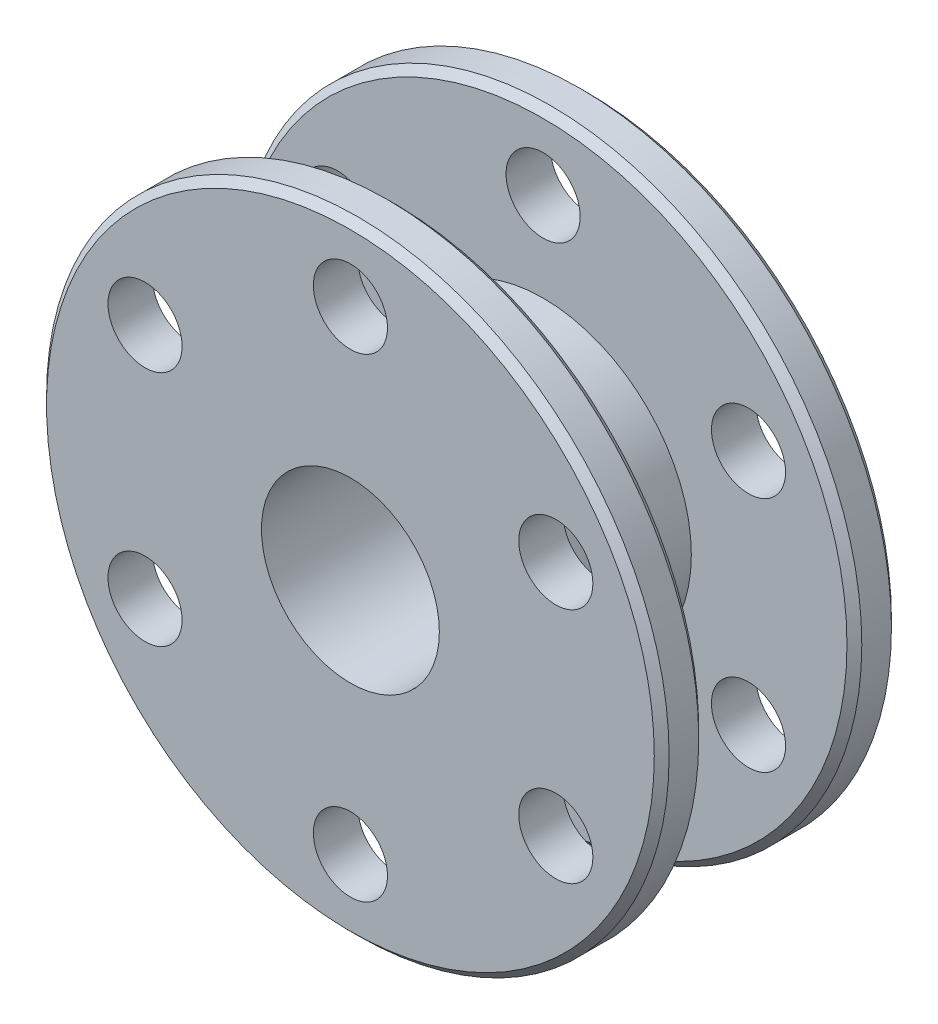
ISO-10303-21;
HEADER;
FILE_DESCRIPTION(('STEP AP214'),'2;1');
FILE_NAME('part.step','',(''),(''),'','','');
FILE_SCHEMA(('AUTOMOTIVE_DESIGN { 1 0 10303 214 1 1 1 1 }'));
ENDSEC;
DATA;
#1=APPLICATION_CONTEXT('core data for automotive mechanical design processes');
#2=APPLICATION_PROTOCOL_DEFINITION('international standard','automotive_design',2000,#1);
#3=PRODUCT_CONTEXT('',#1,'mechanical');
#4=PRODUCT('Part','Part','',(#3));
#5=PRODUCT_RELATED_PRODUCT_CATEGORY('part','',(#4));
#6=PRODUCT_DEFINITION_FORMATION('','',#4);
#7=PRODUCT_DEFINITION_CONTEXT('part definition',#1,'design');
#8=PRODUCT_DEFINITION('design','',#6,#7);
#9=PRODUCT_DEFINITION_SHAPE('','',#8);
#10=(LENGTH_UNIT() NAMED_UNIT(*) SI_UNIT(.MILLI.,.METRE.));
#11=(NAMED_UNIT(*) PLANE_ANGLE_UNIT() SI_UNIT($,.RADIAN.));
#12=(NAMED_UNIT(*) SI_UNIT($,.STERADIAN.) SOLID_ANGLE_UNIT());
#13=UNCERTAINTY_MEASURE_WITH_UNIT(LENGTH_MEASURE(1.E-05),#10,'distance_accuracy_value','');
#14=(GEOMETRIC_REPRESENTATION_CONTEXT(3) GLOBAL_UNCERTAINTY_ASSIGNED_CONTEXT((#13)) GLOBAL_UNIT_ASSIGNED_CONTEXT((#10,
#11,#12)) REPRESENTATION_CONTEXT('',''));
#15=CARTESIAN_POINT('',(0.,0.,0.));
#16=DIRECTION('',(0.,0.,1.));
#17=DIRECTION('',(1.,0.,0.));
#18=AXIS2_PLACEMENT_3D('',#15,#16,#17);
#19=CARTESIAN_POINT('',(0.,0.,16.));
#20=DIRECTION('',(0.,0.,-1.));
#21=DIRECTION('',(-1.,0.,0.));
#22=AXIS2_PLACEMENT_3D('',#19,#20,#21);
#23=CYLINDRICAL_SURFACE('',#22,6.);
#24=CARTESIAN_POINT('',(0.,0.,16.));
#25=DIRECTION('',(0.,0.,1.));
#26=DIRECTION('',(1.,0.,0.));
#27=AXIS2_PLACEMENT_3D('',#24,#25,#26);
#28=CIRCLE('',#27,6.);
#29=CARTESIAN_POINT('',(6.,0.,16.));
#30=VERTEX_POINT('',#29);
#31=EDGE_CURVE('E68',#30,#30,#28,.T.);
#32=ORIENTED_EDGE('',*,*,#31,.T.);
#33=EDGE_LOOP('',(#32));
#34=FACE_BOUND('',#33,.T.);
#35=CARTESIAN_POINT('',(0.,0.,0.));
#36=DIRECTION('',(0.,0.,1.));
#37=DIRECTION('',(1.,0.,0.));
#38=AXIS2_PLACEMENT_3D('',#35,#36,#37);
#39=CIRCLE('',#38,6.);
#40=CARTESIAN_POINT('',(6.,0.,0.));
#41=VERTEX_POINT('',#40);
#42=EDGE_CURVE('E69',#41,#41,#39,.T.);
#43=ORIENTED_EDGE('',*,*,#42,.F.);
#44=EDGE_LOOP('',(#43));
#45=FACE_BOUND('',#44,.T.);
#46=ADVANCED_FACE('F35',(#34,#45),#23,.F.);
#47=CARTESIAN_POINT('',(0.,0.,16.));
#48=DIRECTION('',(0.,0.,-1.));
#49=DIRECTION('',(-1.,0.,0.));
#50=AXIS2_PLACEMENT_3D('',#47,#48,#49);
#51=CYLINDRICAL_SURFACE('',#50,10.);
#52=CARTESIAN_POINT('',(0.,0.,13.));
#53=DIRECTION('',(0.,0.,1.));
#54=DIRECTION('',(1.,0.,0.));
#55=AXIS2_PLACEMENT_3D('',#52,#53,#54);
#56=CIRCLE('',#55,10.);
#57=CARTESIAN_POINT('',(10.,0.,13.));
#58=VERTEX_POINT('',#57);
#59=EDGE_CURVE('E94',#58,#58,#56,.T.);
#60=ORIENTED_EDGE('',*,*,#59,.F.);
#61=EDGE_LOOP('',(#60));
#62=FACE_BOUND('',#61,.T.);
#63=CARTESIAN_POINT('',(0.,0.,3.));
#64=DIRECTION('',(0.,0.,1.));
#65=DIRECTION('',(1.,0.,0.));
#66=AXIS2_PLACEMENT_3D('',#63,#64,#65);
#67=CIRCLE('',#66,10.);
#68=CARTESIAN_POINT('',(10.,0.,3.));
#69=VERTEX_POINT('',#68);
#70=EDGE_CURVE('E72',#69,#69,#67,.T.);
#71=ORIENTED_EDGE('',*,*,#70,.T.);
#72=EDGE_LOOP('',(#71));
#73=FACE_BOUND('',#72,.T.);
#74=ADVANCED_FACE('F168',(#62,#73),#51,.T.);
#75=CARTESIAN_POINT('',(0.,0.,16.));
#76=DIRECTION('',(0.,0.,1.));
#77=DIRECTION('',(1.,0.,0.));
#78=AXIS2_PLACEMENT_3D('',#75,#76,#77);
#79=PLANE('',#78);
#80=CARTESIAN_POINT('',(0.,0.,16.));
#81=DIRECTION('',(0.,0.,1.));
#82=DIRECTION('',(1.,0.,0.));
#83=AXIS2_PLACEMENT_3D('',#80,#81,#82);
#84=CIRCLE('',#83,20.5);
#85=CARTESIAN_POINT('',(20.5,0.,16.));
#86=VERTEX_POINT('',#85);
#87=EDGE_CURVE('E10',#86,#86,#84,.T.);
#88=ORIENTED_EDGE('',*,*,#87,.T.);
#89=EDGE_LOOP('',(#88));
#90=FACE_BOUND('',#89,.T.);
#91=ORIENTED_EDGE('',*,*,#31,.F.);
#92=EDGE_LOOP('',(#91));
#93=FACE_BOUND('',#92,.T.);
#94=CARTESIAN_POINT('',(-13.856406460551,8.,16.));
#95=DIRECTION('',(0.,0.,1.));
#96=DIRECTION('',(1.,0.,0.));
#97=AXIS2_PLACEMENT_3D('',#94,#95,#96);
#98=CIRCLE('',#97,2.50000000000018);
#99=CARTESIAN_POINT('',(-11.3564064605509,8.,16.));
#100=VERTEX_POINT('',#99);
#101=EDGE_CURVE('E130',#100,#100,#98,.T.);
#102=ORIENTED_EDGE('',*,*,#101,.F.);
#103=EDGE_LOOP('',(#102));
#104=FACE_BOUND('',#103,.T.);
#105=CARTESIAN_POINT('',(-13.856406460551,-8.,16.));
#106=DIRECTION('',(0.,0.,1.));
#107=DIRECTION('',(1.,0.,0.));
#108=AXIS2_PLACEMENT_3D('',#105,#106,#107);
#109=CIRCLE('',#108,2.50000000000013);
#110=CARTESIAN_POINT('',(-11.3564064605509,-8.,16.));
#111=VERTEX_POINT('',#110);
#112=EDGE_CURVE('E127',#111,#111,#109,.T.);
#113=ORIENTED_EDGE('',*,*,#112,.F.);
#114=EDGE_LOOP('',(#113));
#115=FACE_BOUND('',#114,.T.);
#116=CARTESIAN_POINT('',(0.,-16.,16.));
#117=DIRECTION('',(0.,0.,1.));
#118=DIRECTION('',(1.,0.,0.));
#119=AXIS2_PLACEMENT_3D('',#116,#117,#118);
#120=CIRCLE('',#119,2.50000000000009);
#121=CARTESIAN_POINT('',(2.50000000000008,-16.,16.));
#122=VERTEX_POINT('',#121);
#123=EDGE_CURVE('E124',#122,#122,#120,.T.);
#124=ORIENTED_EDGE('',*,*,#123,.F.);
#125=EDGE_LOOP('',(#124));
#126=FACE_BOUND('',#125,.T.);
#127=CARTESIAN_POINT('',(13.856406460551,-8.,16.));
#128=DIRECTION('',(0.,0.,1.));
#129=DIRECTION('',(1.,0.,0.));
#130=AXIS2_PLACEMENT_3D('',#127,#128,#129);
#131=CIRCLE('',#130,2.50000000000007);
#132=CARTESIAN_POINT('',(16.3564064605511,-8.,16.));
#133=VERTEX_POINT('',#132);
#134=EDGE_CURVE('E121',#133,#133,#131,.T.);
#135=ORIENTED_EDGE('',*,*,#134,.F.);
#136=EDGE_LOOP('',(#135));
#137=FACE_BOUND('',#136,.T.);
#138=CARTESIAN_POINT('',(13.856406460551,8.,16.));
#139=DIRECTION('',(0.,0.,1.));
#140=DIRECTION('',(1.,0.,0.));
#141=AXIS2_PLACEMENT_3D('',#138,#139,#140);
#142=CIRCLE('',#141,2.50000000000004);
#143=CARTESIAN_POINT('',(16.356406460551,8.,16.));
#144=VERTEX_POINT('',#143);
#145=EDGE_CURVE('E118',#144,#144,#142,.T.);
#146=ORIENTED_EDGE('',*,*,#145,.F.);
#147=EDGE_LOOP('',(#146));
#148=FACE_BOUND('',#147,.T.);
#149=CARTESIAN_POINT('',(0.,16.,16.));
#150=DIRECTION('',(0.,0.,1.));
#151=DIRECTION('',(1.,0.,0.));
#152=AXIS2_PLACEMENT_3D('',#149,#150,#151);
#153=CIRCLE('',#152,2.5);
#154=CARTESIAN_POINT('',(2.5,16.,16.));
#155=VERTEX_POINT('',#154);
#156=EDGE_CURVE('E114',#155,#155,#153,.T.);
#157=ORIENTED_EDGE('',*,*,#156,.F.);
#158=EDGE_LOOP('',(#157));
#159=FACE_BOUND('',#158,.T.);
#160=ADVANCED_FACE('F164',(#90,#93,#104,#115,#126,#137,#148,#159),#79,.T.);
#161=CARTESIAN_POINT('',(0.,0.,0.));
#162=DIRECTION('',(0.,0.,1.));
#163=DIRECTION('',(1.,0.,0.));
#164=AXIS2_PLACEMENT_3D('',#161,#162,#163);
#165=PLANE('',#164);
#166=CARTESIAN_POINT('',(0.,0.,0.));
#167=DIRECTION('',(0.,0.,1.));
#168=DIRECTION('',(1.,0.,0.));
#169=AXIS2_PLACEMENT_3D('',#166,#167,#168);
#170=CIRCLE('',#169,20.5);
#171=CARTESIAN_POINT('',(20.5,0.,0.));
#172=VERTEX_POINT('',#171);
#173=EDGE_CURVE('E59',#172,#172,#170,.F.);
#174=ORIENTED_EDGE('',*,*,#173,.T.);
#175=EDGE_LOOP('',(#174));
#176=FACE_BOUND('',#175,.T.);
#177=ORIENTED_EDGE('',*,*,#42,.T.);
#178=EDGE_LOOP('',(#177));
#179=FACE_BOUND('',#178,.T.);
#180=CARTESIAN_POINT('',(-13.856406460551,8.,0.));
#181=DIRECTION('',(0.,0.,1.));
#182=DIRECTION('',(1.,0.,0.));
#183=AXIS2_PLACEMENT_3D('',#180,#181,#182);
#184=CIRCLE('',#183,2.50000000000018);
#185=CARTESIAN_POINT('',(-11.3564064605509,8.,0.));
#186=VERTEX_POINT('',#185);
#187=EDGE_CURVE('E91',#186,#186,#184,.T.);
#188=ORIENTED_EDGE('',*,*,#187,.T.);
#189=EDGE_LOOP('',(#188));
#190=FACE_BOUND('',#189,.T.);
#191=CARTESIAN_POINT('',(-13.856406460551,-8.,0.));
#192=DIRECTION('',(0.,0.,1.));
#193=DIRECTION('',(1.,0.,0.));
#194=AXIS2_PLACEMENT_3D('',#191,#192,#193);
#195=CIRCLE('',#194,2.50000000000013);
#196=CARTESIAN_POINT('',(-11.3564064605509,-8.,0.));
#197=VERTEX_POINT('',#196);
#198=EDGE_CURVE('E88',#197,#197,#195,.T.);
#199=ORIENTED_EDGE('',*,*,#198,.T.);
#200=EDGE_LOOP('',(#199));
#201=FACE_BOUND('',#200,.T.);
#202=CARTESIAN_POINT('',(0.,-16.,0.));
#203=DIRECTION('',(0.,0.,1.));
#204=DIRECTION('',(1.,0.,0.));
#205=AXIS2_PLACEMENT_3D('',#202,#203,#204);
#206=CIRCLE('',#205,2.50000000000009);
#207=CARTESIAN_POINT('',(2.50000000000008,-16.,0.));
#208=VERTEX_POINT('',#207);
#209=EDGE_CURVE('E85',#208,#208,#206,.T.);
#210=ORIENTED_EDGE('',*,*,#209,.T.);
#211=EDGE_LOOP('',(#210));
#212=FACE_BOUND('',#211,.T.);
#213=CARTESIAN_POINT('',(13.856406460551,-8.,0.));
#214=DIRECTION('',(0.,0.,1.));
#215=DIRECTION('',(1.,0.,0.));
#216=AXIS2_PLACEMENT_3D('',#213,#214,#215);
#217=CIRCLE('',#216,2.50000000000007);
#218=CARTESIAN_POINT('',(16.3564064605511,-8.,0.));
#219=VERTEX_POINT('',#218);
#220=EDGE_CURVE('E82',#219,#219,#217,.T.);
#221=ORIENTED_EDGE('',*,*,#220,.T.);
#222=EDGE_LOOP('',(#221));
#223=FACE_BOUND('',#222,.T.);
#224=CARTESIAN_POINT('',(13.856406460551,8.,0.));
#225=DIRECTION('',(0.,0.,1.));
#226=DIRECTION('',(1.,0.,0.));
#227=AXIS2_PLACEMENT_3D('',#224,#225,#226);
#228=CIRCLE('',#227,2.50000000000004);
#229=CARTESIAN_POINT('',(16.356406460551,8.,0.));
#230=VERTEX_POINT('',#229);
#231=EDGE_CURVE('E79',#230,#230,#228,.T.);
#232=ORIENTED_EDGE('',*,*,#231,.T.);
#233=EDGE_LOOP('',(#232));
#234=FACE_BOUND('',#233,.T.);
#235=CARTESIAN_POINT('',(0.,16.,0.));
#236=DIRECTION('',(0.,0.,1.));
#237=DIRECTION('',(1.,0.,0.));
#238=AXIS2_PLACEMENT_3D('',#235,#236,#237);
#239=CIRCLE('',#238,2.5);
#240=CARTESIAN_POINT('',(2.5,16.,0.));
#241=VERTEX_POINT('',#240);
#242=EDGE_CURVE('E75',#241,#241,#239,.T.);
#243=ORIENTED_EDGE('',*,*,#242,.T.);
#244=EDGE_LOOP('',(#243));
#245=FACE_BOUND('',#244,.T.);
#246=ADVANCED_FACE('F167',(#176,#179,#190,#201,#212,#223,#234,#245),#165,.F.);
#247=CARTESIAN_POINT('',(0.,16.,3.));
#248=DIRECTION('',(0.,0.,-1.));
#249=DIRECTION('',(-1.,0.,0.));
#250=AXIS2_PLACEMENT_3D('',#247,#248,#249);
#251=CYLINDRICAL_SURFACE('',#250,2.5);
#252=CARTESIAN_POINT('',(0.,16.,3.));
#253=DIRECTION('',(0.,0.,1.));
#254=DIRECTION('',(1.,0.,0.));
#255=AXIS2_PLACEMENT_3D('',#252,#253,#254);
#256=CIRCLE('',#255,2.5);
#257=CARTESIAN_POINT('',(2.5,16.,3.));
#258=VERTEX_POINT('',#257);
#259=EDGE_CURVE('E97',#258,#258,#256,.T.);
#260=ORIENTED_EDGE('',*,*,#259,.T.);
#261=EDGE_LOOP('',(#260));
#262=FACE_BOUND('',#261,.T.);
#263=ORIENTED_EDGE('',*,*,#242,.F.);
#264=EDGE_LOOP('',(#263));
#265=FACE_BOUND('',#264,.T.);
#266=ADVANCED_FACE('F382',(#262,#265),#251,.F.);
#267=CARTESIAN_POINT('',(13.856406460551,8.,3.));
#268=DIRECTION('',(0.,0.,-1.));
#269=DIRECTION('',(-1.,0.,0.));
#270=AXIS2_PLACEMENT_3D('',#267,#268,#269);
#271=CYLINDRICAL_SURFACE('',#270,2.50000000000004);
#272=CARTESIAN_POINT('',(13.856406460551,8.,3.));
#273=DIRECTION('',(0.,0.,1.));
#274=DIRECTION('',(1.,0.,0.));
#275=AXIS2_PLACEMENT_3D('',#272,#273,#274);
#276=CIRCLE('',#275,2.50000000000004);
#277=CARTESIAN_POINT('',(16.356406460551,8.,3.));
#278=VERTEX_POINT('',#277);
#279=EDGE_CURVE('E100',#278,#278,#276,.T.);
#280=ORIENTED_EDGE('',*,*,#279,.T.);
#281=EDGE_LOOP('',(#280));
#282=FACE_BOUND('',#281,.T.);
#283=ORIENTED_EDGE('',*,*,#231,.F.);
#284=EDGE_LOOP('',(#283));
#285=FACE_BOUND('',#284,.T.);
#286=ADVANCED_FACE('F373',(#282,#285),#271,.F.);
#287=CARTESIAN_POINT('',(13.856406460551,-8.,3.));
#288=DIRECTION('',(0.,0.,-1.));
#289=DIRECTION('',(-1.,0.,0.));
#290=AXIS2_PLACEMENT_3D('',#287,#288,#289);
#291=CYLINDRICAL_SURFACE('',#290,2.50000000000007);
#292=CARTESIAN_POINT('',(13.856406460551,-8.,3.));
#293=DIRECTION('',(0.,0.,1.));
#294=DIRECTION('',(1.,0.,0.));
#295=AXIS2_PLACEMENT_3D('',#292,#293,#294);
#296=CIRCLE('',#295,2.50000000000007);
#297=CARTESIAN_POINT('',(16.3564064605511,-8.,3.));
#298=VERTEX_POINT('',#297);
#299=EDGE_CURVE('E103',#298,#298,#296,.T.);
#300=ORIENTED_EDGE('',*,*,#299,.T.);
#301=EDGE_LOOP('',(#300));
#302=FACE_BOUND('',#301,.T.);
#303=ORIENTED_EDGE('',*,*,#220,.F.);
#304=EDGE_LOOP('',(#303));
#305=FACE_BOUND('',#304,.T.);
#306=ADVANCED_FACE('F364',(#302,#305),#291,.F.);
#307=CARTESIAN_POINT('',(0.,-16.,3.));
#308=DIRECTION('',(0.,0.,-1.));
#309=DIRECTION('',(-1.,0.,0.));
#310=AXIS2_PLACEMENT_3D('',#307,#308,#309);
#311=CYLINDRICAL_SURFACE('',#310,2.50000000000009);
#312=CARTESIAN_POINT('',(0.,-16.,3.));
#313=DIRECTION('',(0.,0.,1.));
#314=DIRECTION('',(1.,0.,0.));
#315=AXIS2_PLACEMENT_3D('',#312,#313,#314);
#316=CIRCLE('',#315,2.50000000000009);
#317=CARTESIAN_POINT('',(2.50000000000008,-16.,3.));
#318=VERTEX_POINT('',#317);
#319=EDGE_CURVE('E106',#318,#318,#316,.T.);
#320=ORIENTED_EDGE('',*,*,#319,.T.);
#321=EDGE_LOOP('',(#320));
#322=FACE_BOUND('',#321,.T.);
#323=ORIENTED_EDGE('',*,*,#209,.F.);
#324=EDGE_LOOP('',(#323));
#325=FACE_BOUND('',#324,.T.);
#326=ADVANCED_FACE('F355',(#322,#325),#311,.F.);
#327=CARTESIAN_POINT('',(-13.856406460551,-8.,3.));
#328=DIRECTION('',(0.,0.,-1.));
#329=DIRECTION('',(-1.,0.,0.));
#330=AXIS2_PLACEMENT_3D('',#327,#328,#329);
#331=CYLINDRICAL_SURFACE('',#330,2.50000000000013);
#332=CARTESIAN_POINT('',(-13.856406460551,-8.,3.));
#333=DIRECTION('',(0.,0.,1.));
#334=DIRECTION('',(1.,0.,0.));
#335=AXIS2_PLACEMENT_3D('',#332,#333,#334);
#336=CIRCLE('',#335,2.50000000000013);
#337=CARTESIAN_POINT('',(-11.3564064605509,-8.,3.));
#338=VERTEX_POINT('',#337);
#339=EDGE_CURVE('E109',#338,#338,#336,.T.);
#340=ORIENTED_EDGE('',*,*,#339,.T.);
#341=EDGE_LOOP('',(#340));
#342=FACE_BOUND('',#341,.T.);
#343=ORIENTED_EDGE('',*,*,#198,.F.);
#344=EDGE_LOOP('',(#343));
#345=FACE_BOUND('',#344,.T.);
#346=ADVANCED_FACE('F346',(#342,#345),#331,.F.);
#347=CARTESIAN_POINT('',(-13.856406460551,8.,3.));
#348=DIRECTION('',(0.,0.,-1.));
#349=DIRECTION('',(-1.,0.,0.));
#350=AXIS2_PLACEMENT_3D('',#347,#348,#349);
#351=CYLINDRICAL_SURFACE('',#350,2.50000000000018);
#352=CARTESIAN_POINT('',(-13.856406460551,8.,3.));
#353=DIRECTION('',(0.,0.,1.));
#354=DIRECTION('',(1.,0.,0.));
#355=AXIS2_PLACEMENT_3D('',#352,#353,#354);
#356=CIRCLE('',#355,2.50000000000018);
#357=CARTESIAN_POINT('',(-11.3564064605509,8.,3.));
#358=VERTEX_POINT('',#357);
#359=EDGE_CURVE('E78',#358,#358,#356,.T.);
#360=ORIENTED_EDGE('',*,*,#359,.T.);
#361=EDGE_LOOP('',(#360));
#362=FACE_BOUND('',#361,.T.);
#363=ORIENTED_EDGE('',*,*,#187,.F.);
#364=EDGE_LOOP('',(#363));
#365=FACE_BOUND('',#364,.T.);
#366=ADVANCED_FACE('F337',(#362,#365),#351,.F.);
#367=CARTESIAN_POINT('',(0.,0.,3.));
#368=DIRECTION('',(0.,0.,-1.));
#369=DIRECTION('',(-1.,0.,0.));
#370=AXIS2_PLACEMENT_3D('',#367,#368,#369);
#371=CYLINDRICAL_SURFACE('',#370,21.);
#372=CARTESIAN_POINT('',(0.,0.,0.499999999999994));
#373=DIRECTION('',(0.,0.,1.));
#374=DIRECTION('',(1.,0.,0.));
#375=AXIS2_PLACEMENT_3D('',#372,#373,#374);
#376=CIRCLE('',#375,21.);
#377=CARTESIAN_POINT('',(21.,0.,0.499999999999994));
#378=VERTEX_POINT('',#377);
#379=EDGE_CURVE('E62',#378,#378,#376,.T.);
#380=ORIENTED_EDGE('',*,*,#379,.T.);
#381=EDGE_LOOP('',(#380));
#382=FACE_BOUND('',#381,.T.);
#383=CARTESIAN_POINT('',(0.,0.,2.50000000000001));
#384=DIRECTION('',(0.,0.,1.));
#385=DIRECTION('',(1.,0.,0.));
#386=AXIS2_PLACEMENT_3D('',#383,#384,#385);
#387=CIRCLE('',#386,21.);
#388=CARTESIAN_POINT('',(21.,0.,2.50000000000001));
#389=VERTEX_POINT('',#388);
#390=EDGE_CURVE('E65',#389,#389,#387,.F.);
#391=ORIENTED_EDGE('',*,*,#390,.T.);
#392=EDGE_LOOP('',(#391));
#393=FACE_BOUND('',#392,.T.);
#394=ADVANCED_FACE('F193',(#382,#393),#371,.T.);
#395=CARTESIAN_POINT('',(0.,0.,3.));
#396=DIRECTION('',(0.,0.,1.));
#397=DIRECTION('',(1.,0.,0.));
#398=AXIS2_PLACEMENT_3D('',#395,#396,#397);
#399=PLANE('',#398);
#400=CARTESIAN_POINT('',(0.,0.,3.));
#401=DIRECTION('',(0.,0.,1.));
#402=DIRECTION('',(1.,0.,0.));
#403=AXIS2_PLACEMENT_3D('',#400,#401,#402);
#404=CIRCLE('',#403,20.5);
#405=CARTESIAN_POINT('',(20.5,0.,3.));
#406=VERTEX_POINT('',#405);
#407=EDGE_CURVE('E56',#406,#406,#404,.T.);
#408=ORIENTED_EDGE('',*,*,#407,.T.);
#409=EDGE_LOOP('',(#408));
#410=FACE_BOUND('',#409,.T.);
#411=ORIENTED_EDGE('',*,*,#359,.F.);
#412=EDGE_LOOP('',(#411));
#413=FACE_BOUND('',#412,.T.);
#414=ORIENTED_EDGE('',*,*,#339,.F.);
#415=EDGE_LOOP('',(#414));
#416=FACE_BOUND('',#415,.T.);
#417=ORIENTED_EDGE('',*,*,#319,.F.);
#418=EDGE_LOOP('',(#417));
#419=FACE_BOUND('',#418,.T.);
#420=ORIENTED_EDGE('',*,*,#299,.F.);
#421=EDGE_LOOP('',(#420));
#422=FACE_BOUND('',#421,.T.);
#423=ORIENTED_EDGE('',*,*,#279,.F.);
#424=EDGE_LOOP('',(#423));
#425=FACE_BOUND('',#424,.T.);
#426=ORIENTED_EDGE('',*,*,#259,.F.);
#427=EDGE_LOOP('',(#426));
#428=FACE_BOUND('',#427,.T.);
#429=ORIENTED_EDGE('',*,*,#70,.F.);
#430=EDGE_LOOP('',(#429));
#431=FACE_BOUND('',#430,.T.);
#432=ADVANCED_FACE('F183',(#410,#413,#416,#419,#422,#425,#428,#431),#399,.T.);
#433=CARTESIAN_POINT('',(0.,16.,13.));
#434=DIRECTION('',(0.,0.,1.));
#435=DIRECTION('',(1.,0.,0.));
#436=AXIS2_PLACEMENT_3D('',#433,#434,#435);
#437=CYLINDRICAL_SURFACE('',#436,2.5);
#438=CARTESIAN_POINT('',(0.,16.,13.));
#439=DIRECTION('',(0.,0.,1.));
#440=DIRECTION('',(1.,0.,0.));
#441=AXIS2_PLACEMENT_3D('',#438,#439,#440);
#442=CIRCLE('',#441,2.5);
#443=CARTESIAN_POINT('',(2.5,16.,13.));
#444=VERTEX_POINT('',#443);
#445=EDGE_CURVE('E135',#444,#444,#442,.T.);
#446=ORIENTED_EDGE('',*,*,#445,.F.);
#447=EDGE_LOOP('',(#446));
#448=FACE_BOUND('',#447,.T.);
#449=ORIENTED_EDGE('',*,*,#156,.T.);
#450=EDGE_LOOP('',(#449));
#451=FACE_BOUND('',#450,.T.);
#452=ADVANCED_FACE('F180',(#448,#451),#437,.F.);
#453=CARTESIAN_POINT('',(13.856406460551,8.,13.));
#454=DIRECTION('',(0.,0.,1.));
#455=DIRECTION('',(1.,0.,0.));
#456=AXIS2_PLACEMENT_3D('',#453,#454,#455);
#457=CYLINDRICAL_SURFACE('',#456,2.50000000000004);
#458=CARTESIAN_POINT('',(13.856406460551,8.,13.));
#459=DIRECTION('',(0.,0.,1.));
#460=DIRECTION('',(1.,0.,0.));
#461=AXIS2_PLACEMENT_3D('',#458,#459,#460);
#462=CIRCLE('',#461,2.50000000000004);
#463=CARTESIAN_POINT('',(16.356406460551,8.,13.));
#464=VERTEX_POINT('',#463);
#465=EDGE_CURVE('E138',#464,#464,#462,.T.);
#466=ORIENTED_EDGE('',*,*,#465,.F.);
#467=EDGE_LOOP('',(#466));
#468=FACE_BOUND('',#467,.T.);
#469=ORIENTED_EDGE('',*,*,#145,.T.);
#470=EDGE_LOOP('',(#469));
#471=FACE_BOUND('',#470,.T.);
#472=ADVANCED_FACE('F182',(#468,#471),#457,.F.);
#473=CARTESIAN_POINT('',(13.856406460551,-8.,13.));
#474=DIRECTION('',(0.,0.,1.));
#475=DIRECTION('',(1.,0.,0.));
#476=AXIS2_PLACEMENT_3D('',#473,#474,#475);
#477=CYLINDRICAL_SURFACE('',#476,2.50000000000007);
#478=CARTESIAN_POINT('',(13.856406460551,-8.,13.));
#479=DIRECTION('',(0.,0.,1.));
#480=DIRECTION('',(1.,0.,0.));
#481=AXIS2_PLACEMENT_3D('',#478,#479,#480);
#482=CIRCLE('',#481,2.50000000000007);
#483=CARTESIAN_POINT('',(16.3564064605511,-8.,13.));
#484=VERTEX_POINT('',#483);
#485=EDGE_CURVE('E141',#484,#484,#482,.T.);
#486=ORIENTED_EDGE('',*,*,#485,.F.);
#487=EDGE_LOOP('',(#486));
#488=FACE_BOUND('',#487,.T.);
#489=ORIENTED_EDGE('',*,*,#134,.T.);
#490=EDGE_LOOP('',(#489));
#491=FACE_BOUND('',#490,.T.);
#492=ADVANCED_FACE('F190',(#488,#491),#477,.F.);
#493=CARTESIAN_POINT('',(0.,-16.,13.));
#494=DIRECTION('',(0.,0.,1.));
#495=DIRECTION('',(1.,0.,0.));
#496=AXIS2_PLACEMENT_3D('',#493,#494,#495);
#497=CYLINDRICAL_SURFACE('',#496,2.50000000000009);
#498=CARTESIAN_POINT('',(0.,-16.,13.));
#499=DIRECTION('',(0.,0.,1.));
#500=DIRECTION('',(1.,0.,0.));
#501=AXIS2_PLACEMENT_3D('',#498,#499,#500);
#502=CIRCLE('',#501,2.50000000000009);
#503=CARTESIAN_POINT('',(2.50000000000008,-16.,13.));
#504=VERTEX_POINT('',#503);
#505=EDGE_CURVE('E144',#504,#504,#502,.T.);
#506=ORIENTED_EDGE('',*,*,#505,.F.);
#507=EDGE_LOOP('',(#506));
#508=FACE_BOUND('',#507,.T.);
#509=ORIENTED_EDGE('',*,*,#123,.T.);
#510=EDGE_LOOP('',(#509));
#511=FACE_BOUND('',#510,.T.);
#512=ADVANCED_FACE('F288',(#508,#511),#497,.F.);
#513=CARTESIAN_POINT('',(-13.856406460551,-8.,13.));
#514=DIRECTION('',(0.,0.,1.));
#515=DIRECTION('',(1.,0.,0.));
#516=AXIS2_PLACEMENT_3D('',#513,#514,#515);
#517=CYLINDRICAL_SURFACE('',#516,2.50000000000013);
#518=CARTESIAN_POINT('',(-13.856406460551,-8.,13.));
#519=DIRECTION('',(0.,0.,1.));
#520=DIRECTION('',(1.,0.,0.));
#521=AXIS2_PLACEMENT_3D('',#518,#519,#520);
#522=CIRCLE('',#521,2.50000000000013);
#523=CARTESIAN_POINT('',(-11.3564064605509,-8.,13.));
#524=VERTEX_POINT('',#523);
#525=EDGE_CURVE('E147',#524,#524,#522,.T.);
#526=ORIENTED_EDGE('',*,*,#525,.F.);
#527=EDGE_LOOP('',(#526));
#528=FACE_BOUND('',#527,.T.);
#529=ORIENTED_EDGE('',*,*,#112,.T.);
#530=EDGE_LOOP('',(#529));
#531=FACE_BOUND('',#530,.T.);
#532=ADVANCED_FACE('F160',(#528,#531),#517,.F.);
#533=CARTESIAN_POINT('',(-13.856406460551,8.,13.));
#534=DIRECTION('',(0.,0.,1.));
#535=DIRECTION('',(1.,0.,0.));
#536=AXIS2_PLACEMENT_3D('',#533,#534,#535);
#537=CYLINDRICAL_SURFACE('',#536,2.50000000000018);
#538=CARTESIAN_POINT('',(-13.856406460551,8.,13.));
#539=DIRECTION('',(0.,0.,1.));
#540=DIRECTION('',(1.,0.,0.));
#541=AXIS2_PLACEMENT_3D('',#538,#539,#540);
#542=CIRCLE('',#541,2.50000000000018);
#543=CARTESIAN_POINT('',(-11.3564064605509,8.,13.));
#544=VERTEX_POINT('',#543);
#545=EDGE_CURVE('E117',#544,#544,#542,.T.);
#546=ORIENTED_EDGE('',*,*,#545,.F.);
#547=EDGE_LOOP('',(#546));
#548=FACE_BOUND('',#547,.T.);
#549=ORIENTED_EDGE('',*,*,#101,.T.);
#550=EDGE_LOOP('',(#549));
#551=FACE_BOUND('',#550,.T.);
#552=ADVANCED_FACE('F156',(#548,#551),#537,.F.);
#553=CARTESIAN_POINT('',(0.,0.,13.));
#554=DIRECTION('',(0.,0.,1.));
#555=DIRECTION('',(1.,0.,0.));
#556=AXIS2_PLACEMENT_3D('',#553,#554,#555);
#557=CYLINDRICAL_SURFACE('',#556,21.);
#558=CARTESIAN_POINT('',(0.,0.,13.5));
#559=DIRECTION('',(0.,0.,-1.));
#560=DIRECTION('',(-1.,0.,0.));
#561=AXIS2_PLACEMENT_3D('',#558,#559,#560);
#562=CIRCLE('',#561,21.);
#563=CARTESIAN_POINT('',(-21.,0.,13.5));
#564=VERTEX_POINT('',#563);
#565=EDGE_CURVE('E47',#564,#564,#562,.F.);
#566=ORIENTED_EDGE('',*,*,#565,.T.);
#567=EDGE_LOOP('',(#566));
#568=FACE_BOUND('',#567,.T.);
#569=CARTESIAN_POINT('',(0.,0.,15.5));
#570=DIRECTION('',(0.,0.,1.));
#571=DIRECTION('',(1.,0.,0.));
#572=AXIS2_PLACEMENT_3D('',#569,#570,#571);
#573=CIRCLE('',#572,21.);
#574=CARTESIAN_POINT('',(21.,0.,15.5));
#575=VERTEX_POINT('',#574);
#576=EDGE_CURVE('E51',#575,#575,#573,.F.);
#577=ORIENTED_EDGE('',*,*,#576,.T.);
#578=EDGE_LOOP('',(#577));
#579=FACE_BOUND('',#578,.T.);
#580=ADVANCED_FACE('F159',(#568,#579),#557,.T.);
#581=CARTESIAN_POINT('',(0.,0.,13.));
#582=DIRECTION('',(0.,0.,-1.));
#583=DIRECTION('',(1.,0.,0.));
#584=AXIS2_PLACEMENT_3D('',#581,#582,#583);
#585=PLANE('',#584);
#586=CARTESIAN_POINT('',(0.,0.,13.));
#587=DIRECTION('',(0.,0.,-1.));
#588=DIRECTION('',(-1.,0.,0.));
#589=AXIS2_PLACEMENT_3D('',#586,#587,#588);
#590=CIRCLE('',#589,20.5);
#591=CARTESIAN_POINT('',(-20.5,0.,13.));
#592=VERTEX_POINT('',#591);
#593=EDGE_CURVE('E43',#592,#592,#590,.T.);
#594=ORIENTED_EDGE('',*,*,#593,.T.);
#595=EDGE_LOOP('',(#594));
#596=FACE_BOUND('',#595,.T.);
#597=ORIENTED_EDGE('',*,*,#545,.T.);
#598=EDGE_LOOP('',(#597));
#599=FACE_BOUND('',#598,.T.);
#600=ORIENTED_EDGE('',*,*,#525,.T.);
#601=EDGE_LOOP('',(#600));
#602=FACE_BOUND('',#601,.T.);
#603=ORIENTED_EDGE('',*,*,#505,.T.);
#604=EDGE_LOOP('',(#603));
#605=FACE_BOUND('',#604,.T.);
#606=ORIENTED_EDGE('',*,*,#485,.T.);
#607=EDGE_LOOP('',(#606));
#608=FACE_BOUND('',#607,.T.);
#609=ORIENTED_EDGE('',*,*,#465,.T.);
#610=EDGE_LOOP('',(#609));
#611=FACE_BOUND('',#610,.T.);
#612=ORIENTED_EDGE('',*,*,#445,.T.);
#613=EDGE_LOOP('',(#612));
#614=FACE_BOUND('',#613,.T.);
#615=ORIENTED_EDGE('',*,*,#59,.T.);
#616=EDGE_LOOP('',(#615));
#617=FACE_BOUND('',#616,.T.);
#618=ADVANCED_FACE('F153',(#596,#599,#602,#605,#608,#611,#614,#617),#585,.T.);
#619=CARTESIAN_POINT('',(0.,0.,0.499999999999994));
#620=DIRECTION('',(0.,0.,1.));
#621=DIRECTION('',(1.,0.,0.));
#622=AXIS2_PLACEMENT_3D('',#619,#620,#621);
#623=CONICAL_SURFACE('',#622,21.,0.785398163397448);
#624=ORIENTED_EDGE('',*,*,#173,.F.);
#625=EDGE_LOOP('',(#624));
#626=FACE_BOUND('',#625,.T.);
#627=ORIENTED_EDGE('',*,*,#379,.F.);
#628=EDGE_LOOP('',(#627));
#629=FACE_BOUND('',#628,.T.);
#630=ADVANCED_FACE('F210',(#626,#629),#623,.T.);
#631=CARTESIAN_POINT('',(0.,0.,3.));
#632=DIRECTION('',(0.,0.,-1.));
#633=DIRECTION('',(-1.,0.,0.));
#634=AXIS2_PLACEMENT_3D('',#631,#632,#633);
#635=CONICAL_SURFACE('',#634,20.5,0.785398163397448);
#636=ORIENTED_EDGE('',*,*,#390,.F.);
#637=EDGE_LOOP('',(#636));
#638=FACE_BOUND('',#637,.T.);
#639=ORIENTED_EDGE('',*,*,#407,.F.);
#640=EDGE_LOOP('',(#639));
#641=FACE_BOUND('',#640,.T.);
#642=ADVANCED_FACE('F216',(#638,#641),#635,.T.);
#643=CARTESIAN_POINT('',(0.,0.,13.5));
#644=DIRECTION('',(0.,0.,1.));
#645=DIRECTION('',(1.,0.,0.));
#646=AXIS2_PLACEMENT_3D('',#643,#644,#645);
#647=CONICAL_SURFACE('',#646,21.,0.785398163397448);
#648=ORIENTED_EDGE('',*,*,#593,.F.);
#649=EDGE_LOOP('',(#648));
#650=FACE_BOUND('',#649,.T.);
#651=ORIENTED_EDGE('',*,*,#565,.F.);
#652=EDGE_LOOP('',(#651));
#653=FACE_BOUND('',#652,.T.);
#654=ADVANCED_FACE('F222',(#650,#653),#647,.T.);
#655=CARTESIAN_POINT('',(0.,0.,16.));
#656=DIRECTION('',(0.,0.,-1.));
#657=DIRECTION('',(-1.,0.,0.));
#658=AXIS2_PLACEMENT_3D('',#655,#656,#657);
#659=CONICAL_SURFACE('',#658,20.5,0.785398163397448);
#660=ORIENTED_EDGE('',*,*,#576,.F.);
#661=EDGE_LOOP('',(#660));
#662=FACE_BOUND('',#661,.T.);
#663=ORIENTED_EDGE('',*,*,#87,.F.);
#664=EDGE_LOOP('',(#663));
#665=FACE_BOUND('',#664,.T.);
#666=ADVANCED_FACE('F38',(#662,#665),#659,.T.);
#667=CLOSED_SHELL('',(#46,#74,#160,#246,#266,#286,#306,#326,#346,#366,#394,#432,#452,#472,#492,
#512,#532,#552,#580,#618,#630,#642,#654,#666));
#668=MANIFOLD_SOLID_BREP('B2',#667);
#669=ADVANCED_BREP_SHAPE_REPRESENTATION('',(#18,#668),#14);
#670=SHAPE_DEFINITION_REPRESENTATION(#9,#669);
ENDSEC;
END-ISO-10303-21;
